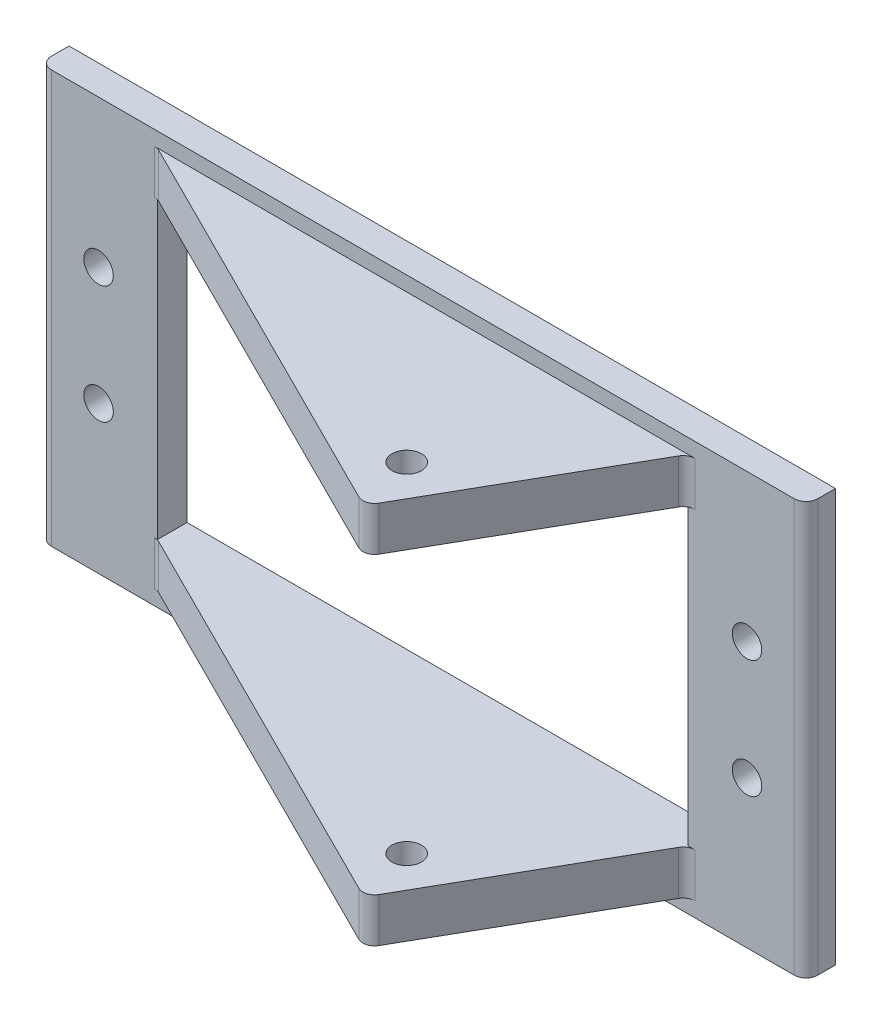
ISO-10303-21;
HEADER;
FILE_DESCRIPTION(('STEP AP214'),'2;1');
FILE_NAME('part.step','',(''),(''),'','','');
FILE_SCHEMA(('AUTOMOTIVE_DESIGN { 1 0 10303 214 1 1 1 1 }'));
ENDSEC;
DATA;
#1=APPLICATION_CONTEXT('core data for automotive mechanical design processes');
#2=APPLICATION_PROTOCOL_DEFINITION('international standard','automotive_design',2000,#1);
#3=PRODUCT_CONTEXT('',#1,'mechanical');
#4=PRODUCT('Part','Part','',(#3));
#5=PRODUCT_RELATED_PRODUCT_CATEGORY('part','',(#4));
#6=PRODUCT_DEFINITION_FORMATION('','',#4);
#7=PRODUCT_DEFINITION_CONTEXT('part definition',#1,'design');
#8=PRODUCT_DEFINITION('design','',#6,#7);
#9=PRODUCT_DEFINITION_SHAPE('','',#8);
#10=(LENGTH_UNIT() NAMED_UNIT(*) SI_UNIT(.MILLI.,.METRE.));
#11=(NAMED_UNIT(*) PLANE_ANGLE_UNIT() SI_UNIT($,.RADIAN.));
#12=(NAMED_UNIT(*) SI_UNIT($,.STERADIAN.) SOLID_ANGLE_UNIT());
#13=UNCERTAINTY_MEASURE_WITH_UNIT(LENGTH_MEASURE(1.E-05),#10,'distance_accuracy_value','');
#14=(GEOMETRIC_REPRESENTATION_CONTEXT(3) GLOBAL_UNCERTAINTY_ASSIGNED_CONTEXT((#13)) GLOBAL_UNIT_ASSIGNED_CONTEXT((#10,
#11,#12)) REPRESENTATION_CONTEXT('',''));
#15=CARTESIAN_POINT('',(0.,0.,0.));
#16=DIRECTION('',(0.,0.,1.));
#17=DIRECTION('',(1.,0.,0.));
#18=AXIS2_PLACEMENT_3D('',#15,#16,#17);
#19=CARTESIAN_POINT('',(-57.15,-31.75,0.));
#20=DIRECTION('',(0.,-1.,0.));
#21=DIRECTION('',(0.,0.,-1.));
#22=AXIS2_PLACEMENT_3D('',#19,#20,#21);
#23=PLANE('',#22);
#24=CARTESIAN_POINT('',(28.2863636363636,-31.75,38.1));
#25=DIRECTION('',(0.,-1.,0.));
#26=DIRECTION('',(0.,0.,-1.));
#27=AXIS2_PLACEMENT_3D('',#24,#25,#26);
#28=CIRCLE('',#27,3.175);
#29=CARTESIAN_POINT('',(28.2863636363636,-31.75,34.925));
#30=VERTEX_POINT('',#29);
#31=EDGE_CURVE('E371',#30,#30,#28,.T.);
#32=ORIENTED_EDGE('',*,*,#31,.T.);
#33=EDGE_LOOP('',(#32));
#34=FACE_BOUND('',#33,.T.);
#35=DIRECTION('',(-0.894427190999916,0.,-0.447213595499958));
#36=VECTOR('',#35,1.);
#37=CARTESIAN_POINT('',(-59.69,-31.75,5.08000000000002));
#38=LINE('',#37,#36);
#39=CARTESIAN_POINT('',(29.6008653168769,-31.75,49.7254326584384));
#40=VERTEX_POINT('',#39);
#41=CARTESIAN_POINT('',(-56.6136901302796,-31.75,6.61815493486022));
#42=VERTEX_POINT('',#41);
#43=EDGE_CURVE('E368',#40,#42,#38,.T.);
#44=ORIENTED_EDGE('',*,*,#43,.F.);
#45=CARTESIAN_POINT('',(30.7367878494467,-31.75,47.4535875932986));
#46=DIRECTION('',(0.,-1.,0.));
#47=DIRECTION('',(0.,0.,-1.));
#48=AXIS2_PLACEMENT_3D('',#45,#46,#47);
#49=CIRCLE('',#48,2.54);
#50=CARTESIAN_POINT('',(32.9421254304429,-31.75,48.713780496725));
#51=VERTEX_POINT('',#50);
#52=EDGE_CURVE('E321',#40,#51,#49,.F.);
#53=ORIENTED_EDGE('',*,*,#52,.T.);
#54=DIRECTION('',(-0.496138938356834,0.,0.868243142124459));
#55=VECTOR('',#54,1.);
#56=CARTESIAN_POINT('',(31.75,-31.75,50.8));
#57=LINE('',#56,#55);
#58=CARTESIAN_POINT('',(56.4186816591008,-31.75,7.62980709657365));
#59=VERTEX_POINT('',#58);
#60=EDGE_CURVE('E515',#59,#51,#57,.T.);
#61=ORIENTED_EDGE('',*,*,#60,.F.);
#62=CARTESIAN_POINT('',(58.6240192400969,-31.75,8.89));
#63=DIRECTION('',(0.,-1.,0.));
#64=DIRECTION('',(0.,0.,-1.));
#65=AXIS2_PLACEMENT_3D('',#62,#63,#64);
#66=CIRCLE('',#65,2.54);
#67=CARTESIAN_POINT('',(58.6240192400969,-31.75,6.35));
#68=VERTEX_POINT('',#67);
#69=EDGE_CURVE('E339',#59,#68,#66,.T.);
#70=ORIENTED_EDGE('',*,*,#69,.T.);
#71=DIRECTION('',(1.,0.,0.));
#72=VECTOR('',#71,1.);
#73=CARTESIAN_POINT('',(-57.15,-31.75,6.35));
#74=LINE('',#73,#72);
#75=CARTESIAN_POINT('',(57.15,-31.75,6.35));
#76=VERTEX_POINT('',#75);
#77=EDGE_CURVE('E86',#76,#68,#74,.T.);
#78=ORIENTED_EDGE('',*,*,#77,.F.);
#79=DIRECTION('',(0.,0.,1.));
#80=VECTOR('',#79,1.);
#81=CARTESIAN_POINT('',(57.15,-31.75,0.));
#82=LINE('',#81,#80);
#83=CARTESIAN_POINT('',(57.15,-31.75,0.));
#84=VERTEX_POINT('',#83);
#85=EDGE_CURVE('E227',#84,#76,#82,.T.);
#86=ORIENTED_EDGE('',*,*,#85,.F.);
#87=DIRECTION('',(1.,0.,0.));
#88=VECTOR('',#87,1.);
#89=CARTESIAN_POINT('',(-57.15,-31.75,0.));
#90=LINE('',#89,#88);
#91=CARTESIAN_POINT('',(-57.15,-31.75,0.));
#92=VERTEX_POINT('',#91);
#93=EDGE_CURVE('E237',#92,#84,#90,.T.);
#94=ORIENTED_EDGE('',*,*,#93,.F.);
#95=DIRECTION('',(0.,0.,1.));
#96=VECTOR('',#95,1.);
#97=CARTESIAN_POINT('',(-57.15,-31.75,0.));
#98=LINE('',#97,#96);
#99=CARTESIAN_POINT('',(-57.15,-31.75,6.35));
#100=VERTEX_POINT('',#99);
#101=EDGE_CURVE('E240',#92,#100,#98,.T.);
#102=ORIENTED_EDGE('',*,*,#101,.T.);
#103=DIRECTION('',(1.,0.,0.));
#104=VECTOR('',#103,1.);
#105=CARTESIAN_POINT('',(-57.15,-31.75,6.35));
#106=LINE('',#105,#104);
#107=CARTESIAN_POINT('',(-57.7496126628495,-31.75,6.35));
#108=VERTEX_POINT('',#107);
#109=EDGE_CURVE('E279',#108,#100,#106,.T.);
#110=ORIENTED_EDGE('',*,*,#109,.F.);
#111=CARTESIAN_POINT('',(-57.7496126628495,-31.75,8.89));
#112=DIRECTION('',(0.,-1.,0.));
#113=DIRECTION('',(0.,0.,-1.));
#114=AXIS2_PLACEMENT_3D('',#111,#112,#113);
#115=CIRCLE('',#114,2.54);
#116=EDGE_CURVE('E346',#108,#42,#115,.T.);
#117=ORIENTED_EDGE('',*,*,#116,.T.);
#118=EDGE_LOOP('',(#44,#53,#61,#70,#78,#86,#94,#102,#110,#117));
#119=FACE_BOUND('',#118,.T.);
#120=ADVANCED_FACE('F63',(#34,#119),#23,.F.);
#121=CARTESIAN_POINT('',(-57.15,31.75,0.));
#122=DIRECTION('',(0.,1.,0.));
#123=DIRECTION('',(0.,0.,1.));
#124=AXIS2_PLACEMENT_3D('',#121,#122,#123);
#125=PLANE('',#124);
#126=CARTESIAN_POINT('',(28.2863636363636,31.75,38.1));
#127=DIRECTION('',(0.,1.,0.));
#128=DIRECTION('',(0.,0.,1.));
#129=AXIS2_PLACEMENT_3D('',#126,#127,#128);
#130=CIRCLE('',#129,3.175);
#131=CARTESIAN_POINT('',(28.2863636363636,31.75,41.275));
#132=VERTEX_POINT('',#131);
#133=EDGE_CURVE('E525',#132,#132,#130,.T.);
#134=ORIENTED_EDGE('',*,*,#133,.T.);
#135=EDGE_LOOP('',(#134));
#136=FACE_BOUND('',#135,.T.);
#137=DIRECTION('',(0.496138938356834,0.,-0.868243142124459));
#138=VECTOR('',#137,1.);
#139=CARTESIAN_POINT('',(31.75,31.75,50.8));
#140=LINE('',#139,#138);
#141=CARTESIAN_POINT('',(32.9421254304429,31.75,48.713780496725));
#142=VERTEX_POINT('',#141);
#143=CARTESIAN_POINT('',(56.4186816591007,31.75,7.62980709657364));
#144=VERTEX_POINT('',#143);
#145=EDGE_CURVE('E522',#142,#144,#140,.T.);
#146=ORIENTED_EDGE('',*,*,#145,.F.);
#147=CARTESIAN_POINT('',(30.7367878494467,31.75,47.4535875932986));
#148=DIRECTION('',(0.,1.,0.));
#149=DIRECTION('',(0.,0.,1.));
#150=AXIS2_PLACEMENT_3D('',#147,#148,#149);
#151=CIRCLE('',#150,2.54);
#152=CARTESIAN_POINT('',(29.6008653168769,31.75,49.7254326584384));
#153=VERTEX_POINT('',#152);
#154=EDGE_CURVE('E323',#142,#153,#151,.F.);
#155=ORIENTED_EDGE('',*,*,#154,.T.);
#156=DIRECTION('',(0.894427190999916,0.,0.447213595499958));
#157=VECTOR('',#156,1.);
#158=CARTESIAN_POINT('',(-59.69,31.75,5.08000000000002));
#159=LINE('',#158,#157);
#160=CARTESIAN_POINT('',(-56.6136901302796,31.75,6.61815493486021));
#161=VERTEX_POINT('',#160);
#162=EDGE_CURVE('E349',#161,#153,#159,.T.);
#163=ORIENTED_EDGE('',*,*,#162,.F.);
#164=CARTESIAN_POINT('',(-57.7496126628495,31.75,8.89));
#165=DIRECTION('',(0.,1.,0.));
#166=DIRECTION('',(0.,0.,1.));
#167=AXIS2_PLACEMENT_3D('',#164,#165,#166);
#168=CIRCLE('',#167,2.54);
#169=CARTESIAN_POINT('',(-57.7496126628495,31.75,6.35));
#170=VERTEX_POINT('',#169);
#171=EDGE_CURVE('E71',#161,#170,#168,.T.);
#172=ORIENTED_EDGE('',*,*,#171,.T.);
#173=DIRECTION('',(-1.,0.,0.));
#174=VECTOR('',#173,1.);
#175=CARTESIAN_POINT('',(-57.15,31.75,6.35));
#176=LINE('',#175,#174);
#177=CARTESIAN_POINT('',(-57.15,31.75,6.35));
#178=VERTEX_POINT('',#177);
#179=EDGE_CURVE('E78',#178,#170,#176,.T.);
#180=ORIENTED_EDGE('',*,*,#179,.F.);
#181=DIRECTION('',(0.,0.,1.));
#182=VECTOR('',#181,1.);
#183=CARTESIAN_POINT('',(-57.15,31.75,0.));
#184=LINE('',#183,#182);
#185=CARTESIAN_POINT('',(-57.15,31.75,0.));
#186=VERTEX_POINT('',#185);
#187=EDGE_CURVE('E236',#186,#178,#184,.T.);
#188=ORIENTED_EDGE('',*,*,#187,.F.);
#189=DIRECTION('',(-1.,0.,0.));
#190=VECTOR('',#189,1.);
#191=CARTESIAN_POINT('',(-57.15,31.75,0.));
#192=LINE('',#191,#190);
#193=CARTESIAN_POINT('',(57.15,31.75,0.));
#194=VERTEX_POINT('',#193);
#195=EDGE_CURVE('E234',#194,#186,#192,.T.);
#196=ORIENTED_EDGE('',*,*,#195,.F.);
#197=DIRECTION('',(0.,0.,1.));
#198=VECTOR('',#197,1.);
#199=CARTESIAN_POINT('',(57.15,31.75,0.));
#200=LINE('',#199,#198);
#201=CARTESIAN_POINT('',(57.15,31.75,6.35));
#202=VERTEX_POINT('',#201);
#203=EDGE_CURVE('E225',#194,#202,#200,.T.);
#204=ORIENTED_EDGE('',*,*,#203,.T.);
#205=DIRECTION('',(-1.,0.,0.));
#206=VECTOR('',#205,1.);
#207=CARTESIAN_POINT('',(-57.15,31.75,6.35));
#208=LINE('',#207,#206);
#209=CARTESIAN_POINT('',(58.6240192400969,31.75,6.35));
#210=VERTEX_POINT('',#209);
#211=EDGE_CURVE('E211',#210,#202,#208,.T.);
#212=ORIENTED_EDGE('',*,*,#211,.F.);
#213=CARTESIAN_POINT('',(58.6240192400969,31.75,8.89));
#214=DIRECTION('',(0.,1.,0.));
#215=DIRECTION('',(0.,0.,1.));
#216=AXIS2_PLACEMENT_3D('',#213,#214,#215);
#217=CIRCLE('',#216,2.54);
#218=EDGE_CURVE('E337',#210,#144,#217,.T.);
#219=ORIENTED_EDGE('',*,*,#218,.T.);
#220=EDGE_LOOP('',(#146,#155,#163,#172,#180,#188,#196,#204,#212,#219));
#221=FACE_BOUND('',#220,.T.);
#222=ADVANCED_FACE('F232',(#136,#221),#125,.F.);
#223=CARTESIAN_POINT('',(57.15,41.275,6.35));
#224=DIRECTION('',(0.,1.,0.));
#225=DIRECTION('',(-1.,0.,0.));
#226=AXIS2_PLACEMENT_3D('',#223,#224,#225);
#227=PLANE('',#226);
#228=CARTESIAN_POINT('',(28.2863636363636,41.275,38.1));
#229=DIRECTION('',(0.,1.,0.));
#230=DIRECTION('',(-1.,0.,0.));
#231=AXIS2_PLACEMENT_3D('',#228,#229,#230);
#232=CIRCLE('',#231,3.175);
#233=CARTESIAN_POINT('',(25.1113636363636,41.275,38.1));
#234=VERTEX_POINT('',#233);
#235=EDGE_CURVE('E521',#234,#234,#232,.T.);
#236=ORIENTED_EDGE('',*,*,#235,.F.);
#237=EDGE_LOOP('',(#236));
#238=FACE_BOUND('',#237,.T.);
#239=DIRECTION('',(0.894427190999916,0.,0.447213595499958));
#240=VECTOR('',#239,1.);
#241=CARTESIAN_POINT('',(34.29,41.275,52.07));
#242=LINE('',#241,#240);
#243=CARTESIAN_POINT('',(-56.6136901302796,41.275,6.6181549348602));
#244=VERTEX_POINT('',#243);
#245=CARTESIAN_POINT('',(29.6008653168768,41.275,49.7254326584384));
#246=VERTEX_POINT('',#245);
#247=EDGE_CURVE('E361',#244,#246,#242,.T.);
#248=ORIENTED_EDGE('',*,*,#247,.T.);
#249=CARTESIAN_POINT('',(30.7367878494467,41.275,47.4535875932986));
#250=DIRECTION('',(0.,1.,0.));
#251=DIRECTION('',(-1.,0.,0.));
#252=AXIS2_PLACEMENT_3D('',#249,#250,#251);
#253=CIRCLE('',#252,2.54);
#254=CARTESIAN_POINT('',(32.9421254304429,41.275,48.713780496725));
#255=VERTEX_POINT('',#254);
#256=EDGE_CURVE('E330',#246,#255,#253,.T.);
#257=ORIENTED_EDGE('',*,*,#256,.T.);
#258=DIRECTION('',(0.496138938356834,0.,-0.868243142124459));
#259=VECTOR('',#258,1.);
#260=CARTESIAN_POINT('',(57.15,41.275,6.35));
#261=LINE('',#260,#259);
#262=CARTESIAN_POINT('',(56.4186816591007,41.275,7.62980709657365));
#263=VERTEX_POINT('',#262);
#264=EDGE_CURVE('E528',#255,#263,#261,.T.);
#265=ORIENTED_EDGE('',*,*,#264,.T.);
#266=CARTESIAN_POINT('',(58.6240192400969,41.275,8.89));
#267=DIRECTION('',(0.,1.,0.));
#268=DIRECTION('',(-1.,0.,0.));
#269=AXIS2_PLACEMENT_3D('',#266,#267,#268);
#270=CIRCLE('',#269,2.54);
#271=CARTESIAN_POINT('',(58.6240192400969,41.275,6.35));
#272=VERTEX_POINT('',#271);
#273=EDGE_CURVE('E334',#263,#272,#270,.F.);
#274=ORIENTED_EDGE('',*,*,#273,.T.);
#275=DIRECTION('',(-1.,0.,0.));
#276=VECTOR('',#275,1.);
#277=CARTESIAN_POINT('',(57.15,41.275,6.35));
#278=LINE('',#277,#276);
#279=CARTESIAN_POINT('',(-57.7496126628495,41.275,6.35));
#280=VERTEX_POINT('',#279);
#281=EDGE_CURVE('E228',#272,#280,#278,.T.);
#282=ORIENTED_EDGE('',*,*,#281,.T.);
#283=CARTESIAN_POINT('',(-57.7496126628495,41.275,8.89));
#284=DIRECTION('',(0.,1.,0.));
#285=DIRECTION('',(-1.,0.,0.));
#286=AXIS2_PLACEMENT_3D('',#283,#284,#285);
#287=CIRCLE('',#286,2.54);
#288=EDGE_CURVE('E12',#280,#244,#287,.F.);
#289=ORIENTED_EDGE('',*,*,#288,.T.);
#290=EDGE_LOOP('',(#248,#257,#265,#274,#282,#289));
#291=FACE_BOUND('',#290,.T.);
#292=ADVANCED_FACE('F360',(#238,#291),#227,.T.);
#293=CARTESIAN_POINT('',(57.15,-41.275,6.35));
#294=DIRECTION('',(0.,-1.,0.));
#295=DIRECTION('',(1.,0.,0.));
#296=AXIS2_PLACEMENT_3D('',#293,#294,#295);
#297=PLANE('',#296);
#298=CARTESIAN_POINT('',(28.2863636363636,-41.275,38.1));
#299=DIRECTION('',(0.,-1.,0.));
#300=DIRECTION('',(1.,0.,0.));
#301=AXIS2_PLACEMENT_3D('',#298,#299,#300);
#302=CIRCLE('',#301,3.175);
#303=CARTESIAN_POINT('',(31.4613636363636,-41.275,38.1));
#304=VERTEX_POINT('',#303);
#305=EDGE_CURVE('E766',#304,#304,#302,.T.);
#306=ORIENTED_EDGE('',*,*,#305,.F.);
#307=EDGE_LOOP('',(#306));
#308=FACE_BOUND('',#307,.T.);
#309=DIRECTION('',(-0.496138938356834,0.,0.868243142124459));
#310=VECTOR('',#309,1.);
#311=CARTESIAN_POINT('',(45.8176923076923,-41.275,26.1815384615384));
#312=LINE('',#311,#310);
#313=CARTESIAN_POINT('',(56.4186816591008,-41.275,7.62980709657364));
#314=VERTEX_POINT('',#313);
#315=CARTESIAN_POINT('',(32.9421254304429,-41.275,48.713780496725));
#316=VERTEX_POINT('',#315);
#317=EDGE_CURVE('E765',#314,#316,#312,.T.);
#318=ORIENTED_EDGE('',*,*,#317,.T.);
#319=CARTESIAN_POINT('',(30.7367878494467,-41.275,47.4535875932986));
#320=DIRECTION('',(0.,-1.,0.));
#321=DIRECTION('',(1.,0.,0.));
#322=AXIS2_PLACEMENT_3D('',#319,#320,#321);
#323=CIRCLE('',#322,2.54);
#324=CARTESIAN_POINT('',(29.6008653168768,-41.275,49.7254326584384));
#325=VERTEX_POINT('',#324);
#326=EDGE_CURVE('E314',#316,#325,#323,.T.);
#327=ORIENTED_EDGE('',*,*,#326,.T.);
#328=DIRECTION('',(-0.894427190999916,0.,-0.447213595499958));
#329=VECTOR('',#328,1.);
#330=CARTESIAN_POINT('',(-13.97,-41.275,27.94));
#331=LINE('',#330,#329);
#332=CARTESIAN_POINT('',(-56.6136901302796,-41.275,6.61815493486021));
#333=VERTEX_POINT('',#332);
#334=EDGE_CURVE('E366',#325,#333,#331,.T.);
#335=ORIENTED_EDGE('',*,*,#334,.T.);
#336=CARTESIAN_POINT('',(-57.7496126628495,-41.275,8.89));
#337=DIRECTION('',(0.,-1.,0.));
#338=DIRECTION('',(1.,0.,0.));
#339=AXIS2_PLACEMENT_3D('',#336,#337,#338);
#340=CIRCLE('',#339,2.54);
#341=CARTESIAN_POINT('',(-57.7496126628495,-41.275,6.35));
#342=VERTEX_POINT('',#341);
#343=EDGE_CURVE('E343',#333,#342,#340,.F.);
#344=ORIENTED_EDGE('',*,*,#343,.T.);
#345=DIRECTION('',(1.,0.,0.));
#346=VECTOR('',#345,1.);
#347=CARTESIAN_POINT('',(57.15,-41.275,6.35));
#348=LINE('',#347,#346);
#349=CARTESIAN_POINT('',(58.6240192400969,-41.275,6.35));
#350=VERTEX_POINT('',#349);
#351=EDGE_CURVE('E229',#342,#350,#348,.T.);
#352=ORIENTED_EDGE('',*,*,#351,.T.);
#353=CARTESIAN_POINT('',(58.6240192400969,-41.275,8.89));
#354=DIRECTION('',(0.,-1.,0.));
#355=DIRECTION('',(1.,0.,0.));
#356=AXIS2_PLACEMENT_3D('',#353,#354,#355);
#357=CIRCLE('',#356,2.54);
#358=EDGE_CURVE('E341',#350,#314,#357,.F.);
#359=ORIENTED_EDGE('',*,*,#358,.T.);
#360=EDGE_LOOP('',(#318,#327,#335,#344,#352,#359));
#361=FACE_BOUND('',#360,.T.);
#362=ADVANCED_FACE('F480',(#308,#361),#297,.T.);
#363=CARTESIAN_POINT('',(82.5499999999999,44.45,50.8));
#364=DIRECTION('',(-1.,0.,0.));
#365=DIRECTION('',(0.,-1.,0.));
#366=AXIS2_PLACEMENT_3D('',#363,#364,#365);
#367=PLANE('',#366);
#368=DIRECTION('',(0.,0.,-1.));
#369=VECTOR('',#368,1.);
#370=CARTESIAN_POINT('',(82.5499999999999,44.45,50.8));
#371=LINE('',#370,#369);
#372=CARTESIAN_POINT('',(82.5499999999999,44.45,3.81));
#373=VERTEX_POINT('',#372);
#374=CARTESIAN_POINT('',(82.5499999999999,44.45,0.));
#375=VERTEX_POINT('',#374);
#376=EDGE_CURVE('E265',#373,#375,#371,.T.);
#377=ORIENTED_EDGE('',*,*,#376,.F.);
#378=DIRECTION('',(0.,1.,0.));
#379=VECTOR('',#378,1.);
#380=CARTESIAN_POINT('',(82.5499999999999,44.45,3.81));
#381=LINE('',#380,#379);
#382=CARTESIAN_POINT('',(82.55,-44.45,3.81));
#383=VERTEX_POINT('',#382);
#384=EDGE_CURVE('E296',#373,#383,#381,.F.);
#385=ORIENTED_EDGE('',*,*,#384,.T.);
#386=DIRECTION('',(0.,0.,-1.));
#387=VECTOR('',#386,1.);
#388=CARTESIAN_POINT('',(82.55,-44.45,50.8));
#389=LINE('',#388,#387);
#390=CARTESIAN_POINT('',(82.55,-44.45,0.));
#391=VERTEX_POINT('',#390);
#392=EDGE_CURVE('E259',#383,#391,#389,.T.);
#393=ORIENTED_EDGE('',*,*,#392,.T.);
#394=DIRECTION('',(0.,1.,0.));
#395=VECTOR('',#394,1.);
#396=CARTESIAN_POINT('',(82.5499999999999,44.45,0.));
#397=LINE('',#396,#395);
#398=EDGE_CURVE('E247',#391,#375,#397,.T.);
#399=ORIENTED_EDGE('',*,*,#398,.T.);
#400=EDGE_LOOP('',(#377,#385,#393,#399));
#401=FACE_BOUND('',#400,.T.);
#402=ADVANCED_FACE('F428',(#401),#367,.F.);
#403=CARTESIAN_POINT('',(-82.5500000000001,44.45,50.8));
#404=DIRECTION('',(0.,-1.,0.));
#405=DIRECTION('',(0.,0.,-1.));
#406=AXIS2_PLACEMENT_3D('',#403,#404,#405);
#407=PLANE('',#406);
#408=DIRECTION('',(-1.,0.,0.));
#409=VECTOR('',#408,1.);
#410=CARTESIAN_POINT('',(82.55,44.45,6.35));
#411=LINE('',#410,#409);
#412=CARTESIAN_POINT('',(80.0099999999999,44.45,6.35));
#413=VERTEX_POINT('',#412);
#414=CARTESIAN_POINT('',(-80.01,44.45,6.35));
#415=VERTEX_POINT('',#414);
#416=EDGE_CURVE('E272',#413,#415,#411,.T.);
#417=ORIENTED_EDGE('',*,*,#416,.F.);
#418=CARTESIAN_POINT('',(80.0099999999999,44.45,3.81));
#419=DIRECTION('',(0.,-1.,0.));
#420=DIRECTION('',(0.,0.,-1.));
#421=AXIS2_PLACEMENT_3D('',#418,#419,#420);
#422=CIRCLE('',#421,2.54);
#423=EDGE_CURVE('E294',#413,#373,#422,.F.);
#424=ORIENTED_EDGE('',*,*,#423,.T.);
#425=ORIENTED_EDGE('',*,*,#376,.T.);
#426=DIRECTION('',(-1.,0.,0.));
#427=VECTOR('',#426,1.);
#428=CARTESIAN_POINT('',(-82.5500000000001,44.45,0.));
#429=LINE('',#428,#427);
#430=CARTESIAN_POINT('',(-82.5500000000001,44.45,0.));
#431=VERTEX_POINT('',#430);
#432=EDGE_CURVE('E250',#375,#431,#429,.T.);
#433=ORIENTED_EDGE('',*,*,#432,.T.);
#434=DIRECTION('',(0.,0.,-1.));
#435=VECTOR('',#434,1.);
#436=CARTESIAN_POINT('',(-82.5500000000001,44.45,50.8));
#437=LINE('',#436,#435);
#438=CARTESIAN_POINT('',(-82.5500000000001,44.45,3.81));
#439=VERTEX_POINT('',#438);
#440=EDGE_CURVE('E263',#439,#431,#437,.T.);
#441=ORIENTED_EDGE('',*,*,#440,.F.);
#442=CARTESIAN_POINT('',(-80.0100000000001,44.45,3.81));
#443=DIRECTION('',(0.,-1.,0.));
#444=DIRECTION('',(0.,0.,-1.));
#445=AXIS2_PLACEMENT_3D('',#442,#443,#444);
#446=CIRCLE('',#445,2.54);
#447=EDGE_CURVE('E292',#439,#415,#446,.F.);
#448=ORIENTED_EDGE('',*,*,#447,.T.);
#449=EDGE_LOOP('',(#417,#424,#425,#433,#441,#448));
#450=FACE_BOUND('',#449,.T.);
#451=ADVANCED_FACE('F442',(#450),#407,.F.);
#452=CARTESIAN_POINT('',(-82.5500000000001,44.45,50.8));
#453=DIRECTION('',(1.,0.,0.));
#454=DIRECTION('',(0.,1.,0.));
#455=AXIS2_PLACEMENT_3D('',#452,#453,#454);
#456=PLANE('',#455);
#457=DIRECTION('',(0.,0.,-1.));
#458=VECTOR('',#457,1.);
#459=CARTESIAN_POINT('',(-82.55,-44.45,50.8));
#460=LINE('',#459,#458);
#461=CARTESIAN_POINT('',(-82.55,-44.45,3.81));
#462=VERTEX_POINT('',#461);
#463=CARTESIAN_POINT('',(-82.55,-44.45,0.));
#464=VERTEX_POINT('',#463);
#465=EDGE_CURVE('E261',#462,#464,#460,.T.);
#466=ORIENTED_EDGE('',*,*,#465,.F.);
#467=DIRECTION('',(0.,-1.,0.));
#468=VECTOR('',#467,1.);
#469=CARTESIAN_POINT('',(-82.5500000000001,44.45,3.81));
#470=LINE('',#469,#468);
#471=EDGE_CURVE('E332',#462,#439,#470,.F.);
#472=ORIENTED_EDGE('',*,*,#471,.T.);
#473=ORIENTED_EDGE('',*,*,#440,.T.);
#474=DIRECTION('',(0.,-1.,0.));
#475=VECTOR('',#474,1.);
#476=CARTESIAN_POINT('',(-82.5500000000001,44.45,0.));
#477=LINE('',#476,#475);
#478=EDGE_CURVE('E253',#431,#464,#477,.T.);
#479=ORIENTED_EDGE('',*,*,#478,.T.);
#480=EDGE_LOOP('',(#466,#472,#473,#479));
#481=FACE_BOUND('',#480,.T.);
#482=ADVANCED_FACE('F437',(#481),#456,.F.);
#483=CARTESIAN_POINT('',(-82.55,-44.45,50.8));
#484=DIRECTION('',(0.,1.,0.));
#485=DIRECTION('',(0.,0.,1.));
#486=AXIS2_PLACEMENT_3D('',#483,#484,#485);
#487=PLANE('',#486);
#488=ORIENTED_EDGE('',*,*,#392,.F.);
#489=CARTESIAN_POINT('',(80.01,-44.45,3.81));
#490=DIRECTION('',(0.,1.,0.));
#491=DIRECTION('',(0.,0.,1.));
#492=AXIS2_PLACEMENT_3D('',#489,#490,#491);
#493=CIRCLE('',#492,2.54);
#494=CARTESIAN_POINT('',(80.01,-44.45,6.35));
#495=VERTEX_POINT('',#494);
#496=EDGE_CURVE('E300',#383,#495,#493,.F.);
#497=ORIENTED_EDGE('',*,*,#496,.T.);
#498=DIRECTION('',(1.,0.,0.));
#499=VECTOR('',#498,1.);
#500=CARTESIAN_POINT('',(82.55,-44.45,6.35));
#501=LINE('',#500,#499);
#502=CARTESIAN_POINT('',(-80.01,-44.45,6.35));
#503=VERTEX_POINT('',#502);
#504=EDGE_CURVE('E380',#503,#495,#501,.T.);
#505=ORIENTED_EDGE('',*,*,#504,.F.);
#506=CARTESIAN_POINT('',(-80.01,-44.45,3.81));
#507=DIRECTION('',(0.,1.,0.));
#508=DIRECTION('',(0.,0.,1.));
#509=AXIS2_PLACEMENT_3D('',#506,#507,#508);
#510=CIRCLE('',#509,2.54);
#511=EDGE_CURVE('E298',#503,#462,#510,.F.);
#512=ORIENTED_EDGE('',*,*,#511,.T.);
#513=ORIENTED_EDGE('',*,*,#465,.T.);
#514=DIRECTION('',(1.,0.,0.));
#515=VECTOR('',#514,1.);
#516=CARTESIAN_POINT('',(-82.55,-44.45,0.));
#517=LINE('',#516,#515);
#518=EDGE_CURVE('E256',#464,#391,#517,.T.);
#519=ORIENTED_EDGE('',*,*,#518,.T.);
#520=EDGE_LOOP('',(#488,#497,#505,#512,#513,#519));
#521=FACE_BOUND('',#520,.T.);
#522=ADVANCED_FACE('F419',(#521),#487,.F.);
#523=CARTESIAN_POINT('',(0.,0.,0.));
#524=DIRECTION('',(0.,0.,1.));
#525=DIRECTION('',(1.,0.,0.));
#526=AXIS2_PLACEMENT_3D('',#523,#524,#525);
#527=PLANE('',#526);
#528=CARTESIAN_POINT('',(69.85,12.7,0.));
#529=DIRECTION('',(0.,0.,1.));
#530=DIRECTION('',(-1.,0.,0.));
#531=AXIS2_PLACEMENT_3D('',#528,#529,#530);
#532=CIRCLE('',#531,3.175);
#533=CARTESIAN_POINT('',(66.675,12.7,0.));
#534=VERTEX_POINT('',#533);
#535=EDGE_CURVE('E393',#534,#534,#532,.T.);
#536=ORIENTED_EDGE('',*,*,#535,.T.);
#537=EDGE_LOOP('',(#536));
#538=FACE_BOUND('',#537,.T.);
#539=CARTESIAN_POINT('',(69.85,-12.7,0.));
#540=DIRECTION('',(0.,0.,1.));
#541=DIRECTION('',(1.,0.,0.));
#542=AXIS2_PLACEMENT_3D('',#539,#540,#541);
#543=CIRCLE('',#542,3.17499999999997);
#544=CARTESIAN_POINT('',(73.025,-12.7,0.));
#545=VERTEX_POINT('',#544);
#546=EDGE_CURVE('E401',#545,#545,#543,.T.);
#547=ORIENTED_EDGE('',*,*,#546,.T.);
#548=EDGE_LOOP('',(#547));
#549=FACE_BOUND('',#548,.T.);
#550=CARTESIAN_POINT('',(-69.85,-12.7,0.));
#551=DIRECTION('',(0.,0.,1.));
#552=DIRECTION('',(-1.,0.,0.));
#553=AXIS2_PLACEMENT_3D('',#550,#551,#552);
#554=CIRCLE('',#553,3.175);
#555=CARTESIAN_POINT('',(-73.025,-12.7,0.));
#556=VERTEX_POINT('',#555);
#557=EDGE_CURVE('E398',#556,#556,#554,.T.);
#558=ORIENTED_EDGE('',*,*,#557,.T.);
#559=EDGE_LOOP('',(#558));
#560=FACE_BOUND('',#559,.T.);
#561=CARTESIAN_POINT('',(-69.85,12.7,0.));
#562=DIRECTION('',(0.,0.,1.));
#563=DIRECTION('',(1.,0.,0.));
#564=AXIS2_PLACEMENT_3D('',#561,#562,#563);
#565=CIRCLE('',#564,3.175);
#566=CARTESIAN_POINT('',(-66.675,12.7,0.));
#567=VERTEX_POINT('',#566);
#568=EDGE_CURVE('E394',#567,#567,#565,.T.);
#569=ORIENTED_EDGE('',*,*,#568,.T.);
#570=EDGE_LOOP('',(#569));
#571=FACE_BOUND('',#570,.T.);
#572=ORIENTED_EDGE('',*,*,#93,.T.);
#573=DIRECTION('',(0.,1.,0.));
#574=VECTOR('',#573,1.);
#575=CARTESIAN_POINT('',(57.15,31.75,0.));
#576=LINE('',#575,#574);
#577=EDGE_CURVE('E397',#84,#194,#576,.T.);
#578=ORIENTED_EDGE('',*,*,#577,.T.);
#579=ORIENTED_EDGE('',*,*,#195,.T.);
#580=DIRECTION('',(0.,-1.,0.));
#581=VECTOR('',#580,1.);
#582=CARTESIAN_POINT('',(-57.15,31.75,0.));
#583=LINE('',#582,#581);
#584=EDGE_CURVE('E243',#186,#92,#583,.T.);
#585=ORIENTED_EDGE('',*,*,#584,.T.);
#586=EDGE_LOOP('',(#572,#578,#579,#585));
#587=FACE_BOUND('',#586,.T.);
#588=ORIENTED_EDGE('',*,*,#398,.F.);
#589=ORIENTED_EDGE('',*,*,#518,.F.);
#590=ORIENTED_EDGE('',*,*,#478,.F.);
#591=ORIENTED_EDGE('',*,*,#432,.F.);
#592=EDGE_LOOP('',(#588,#589,#590,#591));
#593=FACE_BOUND('',#592,.T.);
#594=ADVANCED_FACE('F416',(#538,#549,#560,#571,#587,#593),#527,.F.);
#595=CARTESIAN_POINT('',(57.15,31.75,0.));
#596=DIRECTION('',(1.,0.,0.));
#597=DIRECTION('',(0.,1.,0.));
#598=AXIS2_PLACEMENT_3D('',#595,#596,#597);
#599=PLANE('',#598);
#600=ORIENTED_EDGE('',*,*,#85,.T.);
#601=DIRECTION('',(0.,1.,0.));
#602=VECTOR('',#601,1.);
#603=CARTESIAN_POINT('',(57.15,41.275,6.35));
#604=LINE('',#603,#602);
#605=EDGE_CURVE('E215',#76,#202,#604,.T.);
#606=ORIENTED_EDGE('',*,*,#605,.T.);
#607=ORIENTED_EDGE('',*,*,#203,.F.);
#608=ORIENTED_EDGE('',*,*,#577,.F.);
#609=EDGE_LOOP('',(#600,#606,#607,#608));
#610=FACE_BOUND('',#609,.T.);
#611=ADVANCED_FACE('F223',(#610),#599,.F.);
#612=CARTESIAN_POINT('',(-57.15,31.75,0.));
#613=DIRECTION('',(-1.,0.,0.));
#614=DIRECTION('',(0.,0.,1.));
#615=AXIS2_PLACEMENT_3D('',#612,#613,#614);
#616=PLANE('',#615);
#617=ORIENTED_EDGE('',*,*,#187,.T.);
#618=DIRECTION('',(0.,-1.,0.));
#619=VECTOR('',#618,1.);
#620=CARTESIAN_POINT('',(-57.15,41.275,6.35));
#621=LINE('',#620,#619);
#622=EDGE_CURVE('E355',#178,#100,#621,.T.);
#623=ORIENTED_EDGE('',*,*,#622,.T.);
#624=ORIENTED_EDGE('',*,*,#101,.F.);
#625=ORIENTED_EDGE('',*,*,#584,.F.);
#626=EDGE_LOOP('',(#617,#623,#624,#625));
#627=FACE_BOUND('',#626,.T.);
#628=ADVANCED_FACE('F414',(#627),#616,.F.);
#629=CARTESIAN_POINT('',(-69.85,12.7,0.));
#630=DIRECTION('',(0.,0.,1.));
#631=DIRECTION('',(1.,0.,0.));
#632=AXIS2_PLACEMENT_3D('',#629,#630,#631);
#633=CYLINDRICAL_SURFACE('',#632,3.175);
#634=CARTESIAN_POINT('',(-69.85,12.7,6.35));
#635=DIRECTION('',(0.,0.,-1.));
#636=DIRECTION('',(-1.,0.,0.));
#637=AXIS2_PLACEMENT_3D('',#634,#635,#636);
#638=CIRCLE('',#637,3.175);
#639=CARTESIAN_POINT('',(-73.025,12.7,6.35));
#640=VERTEX_POINT('',#639);
#641=EDGE_CURVE('E390',#640,#640,#638,.F.);
#642=ORIENTED_EDGE('',*,*,#641,.T.);
#643=EDGE_LOOP('',(#642));
#644=FACE_BOUND('',#643,.T.);
#645=ORIENTED_EDGE('',*,*,#568,.F.);
#646=EDGE_LOOP('',(#645));
#647=FACE_BOUND('',#646,.T.);
#648=ADVANCED_FACE('F468',(#644,#647),#633,.F.);
#649=CARTESIAN_POINT('',(-69.85,-12.7,0.));
#650=DIRECTION('',(0.,0.,1.));
#651=DIRECTION('',(1.,0.,0.));
#652=AXIS2_PLACEMENT_3D('',#649,#650,#651);
#653=CYLINDRICAL_SURFACE('',#652,3.175);
#654=CARTESIAN_POINT('',(-69.85,-12.7,6.35));
#655=DIRECTION('',(0.,0.,-1.));
#656=DIRECTION('',(-1.,0.,0.));
#657=AXIS2_PLACEMENT_3D('',#654,#655,#656);
#658=CIRCLE('',#657,3.175);
#659=CARTESIAN_POINT('',(-73.025,-12.7,6.35));
#660=VERTEX_POINT('',#659);
#661=EDGE_CURVE('E387',#660,#660,#658,.F.);
#662=ORIENTED_EDGE('',*,*,#661,.T.);
#663=EDGE_LOOP('',(#662));
#664=FACE_BOUND('',#663,.T.);
#665=ORIENTED_EDGE('',*,*,#557,.F.);
#666=EDGE_LOOP('',(#665));
#667=FACE_BOUND('',#666,.T.);
#668=ADVANCED_FACE('F560',(#664,#667),#653,.F.);
#669=CARTESIAN_POINT('',(69.85,-12.7,0.));
#670=DIRECTION('',(0.,0.,1.));
#671=DIRECTION('',(1.,0.,0.));
#672=AXIS2_PLACEMENT_3D('',#669,#670,#671);
#673=CYLINDRICAL_SURFACE('',#672,3.17499999999997);
#674=CARTESIAN_POINT('',(69.85,-12.7,6.35));
#675=DIRECTION('',(0.,0.,-1.));
#676=DIRECTION('',(-1.,0.,0.));
#677=AXIS2_PLACEMENT_3D('',#674,#675,#676);
#678=CIRCLE('',#677,3.17499999999997);
#679=CARTESIAN_POINT('',(66.6750000000001,-12.7,6.35));
#680=VERTEX_POINT('',#679);
#681=EDGE_CURVE('E271',#680,#680,#678,.F.);
#682=ORIENTED_EDGE('',*,*,#681,.T.);
#683=EDGE_LOOP('',(#682));
#684=FACE_BOUND('',#683,.T.);
#685=ORIENTED_EDGE('',*,*,#546,.F.);
#686=EDGE_LOOP('',(#685));
#687=FACE_BOUND('',#686,.T.);
#688=ADVANCED_FACE('F563',(#684,#687),#673,.F.);
#689=CARTESIAN_POINT('',(69.85,12.7,0.));
#690=DIRECTION('',(0.,0.,1.));
#691=DIRECTION('',(1.,0.,0.));
#692=AXIS2_PLACEMENT_3D('',#689,#690,#691);
#693=CYLINDRICAL_SURFACE('',#692,3.175);
#694=CARTESIAN_POINT('',(69.85,12.7,6.35));
#695=DIRECTION('',(0.,0.,-1.));
#696=DIRECTION('',(-1.,0.,0.));
#697=AXIS2_PLACEMENT_3D('',#694,#695,#696);
#698=CIRCLE('',#697,3.175);
#699=CARTESIAN_POINT('',(66.675,12.7,6.35));
#700=VERTEX_POINT('',#699);
#701=EDGE_CURVE('E268',#700,#700,#698,.F.);
#702=ORIENTED_EDGE('',*,*,#701,.T.);
#703=EDGE_LOOP('',(#702));
#704=FACE_BOUND('',#703,.T.);
#705=ORIENTED_EDGE('',*,*,#535,.F.);
#706=EDGE_LOOP('',(#705));
#707=FACE_BOUND('',#706,.T.);
#708=ADVANCED_FACE('F465',(#704,#707),#693,.F.);
#709=CARTESIAN_POINT('',(0.,0.,6.35));
#710=DIRECTION('',(0.,0.,-1.));
#711=DIRECTION('',(-1.,0.,0.));
#712=AXIS2_PLACEMENT_3D('',#709,#710,#711);
#713=PLANE('',#712);
#714=ORIENTED_EDGE('',*,*,#281,.F.);
#715=DIRECTION('',(0.,1.,0.));
#716=VECTOR('',#715,1.);
#717=CARTESIAN_POINT('',(58.6240192400969,0.,6.35));
#718=LINE('',#717,#716);
#719=EDGE_CURVE('E218',#272,#210,#718,.F.);
#720=ORIENTED_EDGE('',*,*,#719,.T.);
#721=ORIENTED_EDGE('',*,*,#211,.T.);
#722=ORIENTED_EDGE('',*,*,#605,.F.);
#723=ORIENTED_EDGE('',*,*,#77,.T.);
#724=DIRECTION('',(0.,1.,0.));
#725=VECTOR('',#724,1.);
#726=CARTESIAN_POINT('',(58.6240192400969,0.,6.35));
#727=LINE('',#726,#725);
#728=EDGE_CURVE('E284',#68,#350,#727,.F.);
#729=ORIENTED_EDGE('',*,*,#728,.T.);
#730=ORIENTED_EDGE('',*,*,#351,.F.);
#731=DIRECTION('',(0.,-1.,0.));
#732=VECTOR('',#731,1.);
#733=CARTESIAN_POINT('',(-57.7496126628495,0.,6.35));
#734=LINE('',#733,#732);
#735=EDGE_CURVE('E281',#342,#108,#734,.F.);
#736=ORIENTED_EDGE('',*,*,#735,.T.);
#737=ORIENTED_EDGE('',*,*,#109,.T.);
#738=ORIENTED_EDGE('',*,*,#622,.F.);
#739=ORIENTED_EDGE('',*,*,#179,.T.);
#740=DIRECTION('',(0.,-1.,0.));
#741=VECTOR('',#740,1.);
#742=CARTESIAN_POINT('',(-57.7496126628495,0.,6.35));
#743=LINE('',#742,#741);
#744=EDGE_CURVE('E275',#170,#280,#743,.F.);
#745=ORIENTED_EDGE('',*,*,#744,.T.);
#746=EDGE_LOOP('',(#714,#720,#721,#722,#723,#729,#730,#736,#737,#738,#739,#745));
#747=FACE_BOUND('',#746,.T.);
#748=ORIENTED_EDGE('',*,*,#504,.T.);
#749=DIRECTION('',(0.,1.,0.));
#750=VECTOR('',#749,1.);
#751=CARTESIAN_POINT('',(80.01,0.,6.35));
#752=LINE('',#751,#750);
#753=EDGE_CURVE('E289',#495,#413,#752,.T.);
#754=ORIENTED_EDGE('',*,*,#753,.T.);
#755=ORIENTED_EDGE('',*,*,#416,.T.);
#756=DIRECTION('',(0.,-1.,0.));
#757=VECTOR('',#756,1.);
#758=CARTESIAN_POINT('',(-80.01,0.,6.35));
#759=LINE('',#758,#757);
#760=EDGE_CURVE('E267',#415,#503,#759,.T.);
#761=ORIENTED_EDGE('',*,*,#760,.T.);
#762=EDGE_LOOP('',(#748,#754,#755,#761));
#763=FACE_BOUND('',#762,.T.);
#764=ORIENTED_EDGE('',*,*,#661,.F.);
#765=EDGE_LOOP('',(#764));
#766=FACE_BOUND('',#765,.T.);
#767=ORIENTED_EDGE('',*,*,#701,.F.);
#768=EDGE_LOOP('',(#767));
#769=FACE_BOUND('',#768,.T.);
#770=ORIENTED_EDGE('',*,*,#681,.F.);
#771=EDGE_LOOP('',(#770));
#772=FACE_BOUND('',#771,.T.);
#773=ORIENTED_EDGE('',*,*,#641,.F.);
#774=EDGE_LOOP('',(#773));
#775=FACE_BOUND('',#774,.T.);
#776=ADVANCED_FACE('F213',(#747,#763,#766,#769,#772,#775),#713,.F.);
#777=CARTESIAN_POINT('',(-13.97,44.45,27.94));
#778=DIRECTION('',(-0.447213595499958,0.,0.894427190999916));
#779=DIRECTION('',(0.894427190999916,0.,0.447213595499958));
#780=AXIS2_PLACEMENT_3D('',#777,#778,#779);
#781=PLANE('',#780);
#782=ORIENTED_EDGE('',*,*,#334,.F.);
#783=DIRECTION('',(0.,-1.,0.));
#784=VECTOR('',#783,1.);
#785=CARTESIAN_POINT('',(29.6008653168768,44.45,49.7254326584384));
#786=LINE('',#785,#784);
#787=EDGE_CURVE('E319',#325,#40,#786,.F.);
#788=ORIENTED_EDGE('',*,*,#787,.T.);
#789=ORIENTED_EDGE('',*,*,#43,.T.);
#790=DIRECTION('',(0.,-1.,0.));
#791=VECTOR('',#790,1.);
#792=CARTESIAN_POINT('',(-56.6136901302796,44.45,6.61815493486021));
#793=LINE('',#792,#791);
#794=EDGE_CURVE('E316',#42,#333,#793,.T.);
#795=ORIENTED_EDGE('',*,*,#794,.T.);
#796=EDGE_LOOP('',(#782,#788,#789,#795));
#797=FACE_BOUND('',#796,.T.);
#798=ADVANCED_FACE('F510',(#797),#781,.T.);
#799=ORIENTED_EDGE('',*,*,#162,.T.);
#800=DIRECTION('',(0.,-1.,0.));
#801=VECTOR('',#800,1.);
#802=CARTESIAN_POINT('',(29.6008653168768,44.45,49.7254326584384));
#803=LINE('',#802,#801);
#804=EDGE_CURVE('E328',#153,#246,#803,.F.);
#805=ORIENTED_EDGE('',*,*,#804,.T.);
#806=ORIENTED_EDGE('',*,*,#247,.F.);
#807=DIRECTION('',(0.,-1.,0.));
#808=VECTOR('',#807,1.);
#809=CARTESIAN_POINT('',(-56.6136901302796,44.45,6.61815493486021));
#810=LINE('',#809,#808);
#811=EDGE_CURVE('E325',#244,#161,#810,.T.);
#812=ORIENTED_EDGE('',*,*,#811,.T.);
#813=EDGE_LOOP('',(#799,#805,#806,#812));
#814=FACE_BOUND('',#813,.T.);
#815=ADVANCED_FACE('F364',(#814),#781,.T.);
#816=CARTESIAN_POINT('',(45.8176923076923,44.45,26.1815384615384));
#817=DIRECTION('',(0.868243142124459,0.,0.496138938356834));
#818=DIRECTION('',(0.496138938356834,0.,-0.868243142124459));
#819=AXIS2_PLACEMENT_3D('',#816,#817,#818);
#820=PLANE('',#819);
#821=ORIENTED_EDGE('',*,*,#145,.T.);
#822=DIRECTION('',(0.,1.,0.));
#823=VECTOR('',#822,1.);
#824=CARTESIAN_POINT('',(56.4186816591007,44.45,7.62980709657364));
#825=LINE('',#824,#823);
#826=EDGE_CURVE('E305',#144,#263,#825,.T.);
#827=ORIENTED_EDGE('',*,*,#826,.T.);
#828=ORIENTED_EDGE('',*,*,#264,.F.);
#829=DIRECTION('',(0.,-1.,0.));
#830=VECTOR('',#829,1.);
#831=CARTESIAN_POINT('',(32.9421254304429,44.45,48.713780496725));
#832=LINE('',#831,#830);
#833=EDGE_CURVE('E302',#255,#142,#832,.T.);
#834=ORIENTED_EDGE('',*,*,#833,.T.);
#835=EDGE_LOOP('',(#821,#827,#828,#834));
#836=FACE_BOUND('',#835,.T.);
#837=ADVANCED_FACE('F544',(#836),#820,.T.);
#838=ORIENTED_EDGE('',*,*,#317,.F.);
#839=DIRECTION('',(0.,1.,0.));
#840=VECTOR('',#839,1.);
#841=CARTESIAN_POINT('',(56.4186816591007,44.45,7.62980709657364));
#842=LINE('',#841,#840);
#843=EDGE_CURVE('E311',#314,#59,#842,.T.);
#844=ORIENTED_EDGE('',*,*,#843,.T.);
#845=ORIENTED_EDGE('',*,*,#60,.T.);
#846=DIRECTION('',(0.,-1.,0.));
#847=VECTOR('',#846,1.);
#848=CARTESIAN_POINT('',(32.9421254304429,44.45,48.713780496725));
#849=LINE('',#848,#847);
#850=EDGE_CURVE('E308',#51,#316,#849,.T.);
#851=ORIENTED_EDGE('',*,*,#850,.T.);
#852=EDGE_LOOP('',(#838,#844,#845,#851));
#853=FACE_BOUND('',#852,.T.);
#854=ADVANCED_FACE('F518',(#853),#820,.T.);
#855=CARTESIAN_POINT('',(28.2863636363636,44.45,38.1));
#856=DIRECTION('',(0.,-1.,0.));
#857=DIRECTION('',(1.,0.,0.));
#858=AXIS2_PLACEMENT_3D('',#855,#856,#857);
#859=CYLINDRICAL_SURFACE('',#858,3.175);
#860=ORIENTED_EDGE('',*,*,#305,.T.);
#861=EDGE_LOOP('',(#860));
#862=FACE_BOUND('',#861,.T.);
#863=ORIENTED_EDGE('',*,*,#31,.F.);
#864=EDGE_LOOP('',(#863));
#865=FACE_BOUND('',#864,.T.);
#866=ADVANCED_FACE('F535',(#862,#865),#859,.F.);
#867=ORIENTED_EDGE('',*,*,#235,.T.);
#868=EDGE_LOOP('',(#867));
#869=FACE_BOUND('',#868,.T.);
#870=ORIENTED_EDGE('',*,*,#133,.F.);
#871=EDGE_LOOP('',(#870));
#872=FACE_BOUND('',#871,.T.);
#873=ADVANCED_FACE('F484',(#869,#872),#859,.F.);
#874=CARTESIAN_POINT('',(80.01,0.,3.81));
#875=DIRECTION('',(0.,1.,0.));
#876=DIRECTION('',(-1.,0.,0.));
#877=AXIS2_PLACEMENT_3D('',#874,#875,#876);
#878=CYLINDRICAL_SURFACE('',#877,2.54);
#879=ORIENTED_EDGE('',*,*,#496,.F.);
#880=ORIENTED_EDGE('',*,*,#384,.F.);
#881=ORIENTED_EDGE('',*,*,#423,.F.);
#882=ORIENTED_EDGE('',*,*,#753,.F.);
#883=EDGE_LOOP('',(#879,#880,#881,#882));
#884=FACE_BOUND('',#883,.T.);
#885=ADVANCED_FACE('F445',(#884),#878,.T.);
#886=CARTESIAN_POINT('',(58.6240192400969,44.45,8.89));
#887=DIRECTION('',(0.,1.,0.));
#888=DIRECTION('',(-1.,0.,0.));
#889=AXIS2_PLACEMENT_3D('',#886,#887,#888);
#890=CYLINDRICAL_SURFACE('',#889,2.54);
#891=ORIENTED_EDGE('',*,*,#218,.F.);
#892=ORIENTED_EDGE('',*,*,#719,.F.);
#893=ORIENTED_EDGE('',*,*,#273,.F.);
#894=ORIENTED_EDGE('',*,*,#826,.F.);
#895=EDGE_LOOP('',(#891,#892,#893,#894));
#896=FACE_BOUND('',#895,.T.);
#897=ADVANCED_FACE('F483',(#896),#890,.F.);
#898=CARTESIAN_POINT('',(58.6240192400969,44.45,8.89));
#899=DIRECTION('',(0.,1.,0.));
#900=DIRECTION('',(-1.,0.,0.));
#901=AXIS2_PLACEMENT_3D('',#898,#899,#900);
#902=CYLINDRICAL_SURFACE('',#901,2.54);
#903=ORIENTED_EDGE('',*,*,#358,.F.);
#904=ORIENTED_EDGE('',*,*,#728,.F.);
#905=ORIENTED_EDGE('',*,*,#69,.F.);
#906=ORIENTED_EDGE('',*,*,#843,.F.);
#907=EDGE_LOOP('',(#903,#904,#905,#906));
#908=FACE_BOUND('',#907,.T.);
#909=ADVANCED_FACE('F487',(#908),#902,.F.);
#910=CARTESIAN_POINT('',(30.7367878494467,44.45,47.4535875932986));
#911=DIRECTION('',(0.,-1.,0.));
#912=DIRECTION('',(1.,0.,0.));
#913=AXIS2_PLACEMENT_3D('',#910,#911,#912);
#914=CYLINDRICAL_SURFACE('',#913,2.54);
#915=ORIENTED_EDGE('',*,*,#52,.F.);
#916=ORIENTED_EDGE('',*,*,#787,.F.);
#917=ORIENTED_EDGE('',*,*,#326,.F.);
#918=ORIENTED_EDGE('',*,*,#850,.F.);
#919=EDGE_LOOP('',(#915,#916,#917,#918));
#920=FACE_BOUND('',#919,.T.);
#921=ADVANCED_FACE('F491',(#920),#914,.T.);
#922=CARTESIAN_POINT('',(30.7367878494467,44.45,47.4535875932986));
#923=DIRECTION('',(0.,-1.,0.));
#924=DIRECTION('',(1.,0.,0.));
#925=AXIS2_PLACEMENT_3D('',#922,#923,#924);
#926=CYLINDRICAL_SURFACE('',#925,2.54);
#927=ORIENTED_EDGE('',*,*,#256,.F.);
#928=ORIENTED_EDGE('',*,*,#804,.F.);
#929=ORIENTED_EDGE('',*,*,#154,.F.);
#930=ORIENTED_EDGE('',*,*,#833,.F.);
#931=EDGE_LOOP('',(#927,#928,#929,#930));
#932=FACE_BOUND('',#931,.T.);
#933=ADVANCED_FACE('F495',(#932),#926,.T.);
#934=CARTESIAN_POINT('',(-57.7496126628495,44.45,8.89));
#935=DIRECTION('',(0.,-1.,0.));
#936=DIRECTION('',(1.,0.,0.));
#937=AXIS2_PLACEMENT_3D('',#934,#935,#936);
#938=CYLINDRICAL_SURFACE('',#937,2.54);
#939=ORIENTED_EDGE('',*,*,#116,.F.);
#940=ORIENTED_EDGE('',*,*,#735,.F.);
#941=ORIENTED_EDGE('',*,*,#343,.F.);
#942=ORIENTED_EDGE('',*,*,#794,.F.);
#943=EDGE_LOOP('',(#939,#940,#941,#942));
#944=FACE_BOUND('',#943,.T.);
#945=ADVANCED_FACE('F453',(#944),#938,.F.);
#946=CARTESIAN_POINT('',(-57.7496126628495,44.45,8.89));
#947=DIRECTION('',(0.,-1.,0.));
#948=DIRECTION('',(1.,0.,0.));
#949=AXIS2_PLACEMENT_3D('',#946,#947,#948);
#950=CYLINDRICAL_SURFACE('',#949,2.54);
#951=ORIENTED_EDGE('',*,*,#288,.F.);
#952=ORIENTED_EDGE('',*,*,#744,.F.);
#953=ORIENTED_EDGE('',*,*,#171,.F.);
#954=ORIENTED_EDGE('',*,*,#811,.F.);
#955=EDGE_LOOP('',(#951,#952,#953,#954));
#956=FACE_BOUND('',#955,.T.);
#957=ADVANCED_FACE('F356',(#956),#950,.F.);
#958=CARTESIAN_POINT('',(-80.01,0.,3.81));
#959=DIRECTION('',(0.,-1.,0.));
#960=DIRECTION('',(1.,0.,0.));
#961=AXIS2_PLACEMENT_3D('',#958,#959,#960);
#962=CYLINDRICAL_SURFACE('',#961,2.54);
#963=ORIENTED_EDGE('',*,*,#447,.F.);
#964=ORIENTED_EDGE('',*,*,#471,.F.);
#965=ORIENTED_EDGE('',*,*,#511,.F.);
#966=ORIENTED_EDGE('',*,*,#760,.F.);
#967=EDGE_LOOP('',(#963,#964,#965,#966));
#968=FACE_BOUND('',#967,.T.);
#969=ADVANCED_FACE('F65',(#968),#962,.T.);
#970=CLOSED_SHELL('',(#120,#222,#292,#362,#402,#451,#482,#522,#594,#611,#628,#648,#668,#688,
#708,#776,#798,#815,#837,#854,#866,#873,#885,#897,#909,#921,#933,#945,#957,#969));
#971=MANIFOLD_SOLID_BREP('B2',#970);
#972=ADVANCED_BREP_SHAPE_REPRESENTATION('',(#18,#971),#14);
#973=SHAPE_DEFINITION_REPRESENTATION(#9,#972);
ENDSEC;
END-ISO-10303-21;
